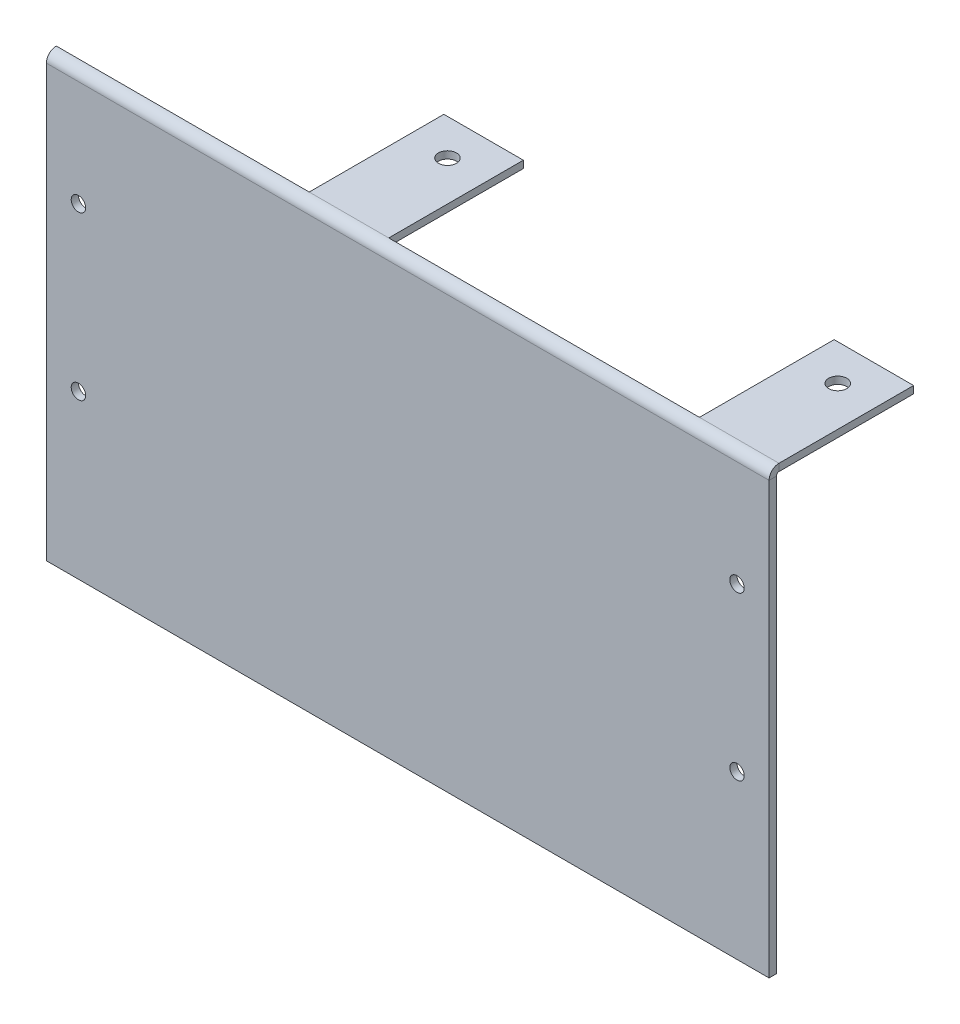
ISO-10303-21;
HEADER;
FILE_DESCRIPTION(('STEP AP214'),'2;1');
FILE_NAME('part.step','',(''),(''),'','','');
FILE_SCHEMA(('AUTOMOTIVE_DESIGN { 1 0 10303 214 1 1 1 1 }'));
ENDSEC;
DATA;
#1=APPLICATION_CONTEXT('core data for automotive mechanical design processes');
#2=APPLICATION_PROTOCOL_DEFINITION('international standard','automotive_design',2000,#1);
#3=PRODUCT_CONTEXT('',#1,'mechanical');
#4=PRODUCT('Part','Part','',(#3));
#5=PRODUCT_RELATED_PRODUCT_CATEGORY('part','',(#4));
#6=PRODUCT_DEFINITION_FORMATION('','',#4);
#7=PRODUCT_DEFINITION_CONTEXT('part definition',#1,'design');
#8=PRODUCT_DEFINITION('design','',#6,#7);
#9=PRODUCT_DEFINITION_SHAPE('','',#8);
#10=(LENGTH_UNIT() NAMED_UNIT(*) SI_UNIT(.MILLI.,.METRE.));
#11=(NAMED_UNIT(*) PLANE_ANGLE_UNIT() SI_UNIT($,.RADIAN.));
#12=(NAMED_UNIT(*) SI_UNIT($,.STERADIAN.) SOLID_ANGLE_UNIT());
#13=UNCERTAINTY_MEASURE_WITH_UNIT(LENGTH_MEASURE(1.E-05),#10,'distance_accuracy_value','');
#14=(GEOMETRIC_REPRESENTATION_CONTEXT(3) GLOBAL_UNCERTAINTY_ASSIGNED_CONTEXT((#13)) GLOBAL_UNIT_ASSIGNED_CONTEXT((#10,
#11,#12)) REPRESENTATION_CONTEXT('',''));
#15=CARTESIAN_POINT('',(0.,0.,0.));
#16=DIRECTION('',(0.,0.,1.));
#17=DIRECTION('',(1.,0.,0.));
#18=AXIS2_PLACEMENT_3D('',#15,#16,#17);
#19=CARTESIAN_POINT('',(0.,122.,4.45228893450774E-13));
#20=DIRECTION('',(0.,1.,0.));
#21=DIRECTION('',(0.,0.,1.));
#22=AXIS2_PLACEMENT_3D('',#19,#20,#21);
#23=PLANE('',#22);
#24=DIRECTION('',(0.,0.,-1.));
#25=VECTOR('',#24,1.);
#26=CARTESIAN_POINT('',(178.,122.,-2.73659999999998));
#27=LINE('',#26,#25);
#28=CARTESIAN_POINT('',(178.,122.,-2.73659999999998));
#29=VERTEX_POINT('',#28);
#30=CARTESIAN_POINT('',(178.,122.,-40.));
#31=VERTEX_POINT('',#30);
#32=EDGE_CURVE('E290',#29,#31,#27,.T.);
#33=ORIENTED_EDGE('',*,*,#32,.F.);
#34=DIRECTION('',(1.,0.,0.));
#35=VECTOR('',#34,1.);
#36=CARTESIAN_POINT('',(0.,122.,-2.7366));
#37=LINE('',#36,#35);
#38=CARTESIAN_POINT('',(200.,122.,-2.7366));
#39=VERTEX_POINT('',#38);
#40=EDGE_CURVE('E246',#29,#39,#37,.T.);
#41=ORIENTED_EDGE('',*,*,#40,.T.);
#42=DIRECTION('',(0.,0.,1.));
#43=VECTOR('',#42,1.);
#44=CARTESIAN_POINT('',(200.,122.,-1.99999999999999));
#45=LINE('',#44,#43);
#46=CARTESIAN_POINT('',(200.,122.,-40.));
#47=VERTEX_POINT('',#46);
#48=EDGE_CURVE('E156',#47,#39,#45,.T.);
#49=ORIENTED_EDGE('',*,*,#48,.F.);
#50=DIRECTION('',(1.,0.,0.));
#51=VECTOR('',#50,1.);
#52=CARTESIAN_POINT('',(200.,122.,-40.));
#53=LINE('',#52,#51);
#54=EDGE_CURVE('E152',#31,#47,#53,.T.);
#55=ORIENTED_EDGE('',*,*,#54,.F.);
#56=EDGE_LOOP('',(#33,#41,#49,#55));
#57=FACE_BOUND('',#56,.T.);
#58=CARTESIAN_POINT('',(189.,122.,-30.));
#59=DIRECTION('',(0.,1.,0.));
#60=DIRECTION('',(0.,0.,1.));
#61=AXIS2_PLACEMENT_3D('',#58,#59,#60);
#62=CIRCLE('',#61,2.5);
#63=CARTESIAN_POINT('',(189.,122.,-27.5));
#64=VERTEX_POINT('',#63);
#65=EDGE_CURVE('E266',#64,#64,#62,.T.);
#66=ORIENTED_EDGE('',*,*,#65,.F.);
#67=EDGE_LOOP('',(#66));
#68=FACE_BOUND('',#67,.T.);
#69=ADVANCED_FACE('F38',(#57,#68),#23,.T.);
#70=CARTESIAN_POINT('',(0.,120.,4.38245930773088E-13));
#71=DIRECTION('',(0.,1.,0.));
#72=DIRECTION('',(0.,0.,1.));
#73=AXIS2_PLACEMENT_3D('',#70,#71,#72);
#74=PLANE('',#73);
#75=CARTESIAN_POINT('',(189.,120.,-30.));
#76=DIRECTION('',(0.,1.,0.));
#77=DIRECTION('',(0.,0.,1.));
#78=AXIS2_PLACEMENT_3D('',#75,#76,#77);
#79=CIRCLE('',#78,2.5);
#80=CARTESIAN_POINT('',(189.,120.,-27.5));
#81=VERTEX_POINT('',#80);
#82=EDGE_CURVE('E261',#81,#81,#79,.F.);
#83=ORIENTED_EDGE('',*,*,#82,.F.);
#84=EDGE_LOOP('',(#83));
#85=FACE_BOUND('',#84,.T.);
#86=DIRECTION('',(1.,0.,0.));
#87=VECTOR('',#86,1.);
#88=CARTESIAN_POINT('',(0.,120.,-2.73660000000001));
#89=LINE('',#88,#87);
#90=CARTESIAN_POINT('',(178.,120.,-2.73659999999999));
#91=VERTEX_POINT('',#90);
#92=CARTESIAN_POINT('',(200.,120.,-2.73660000000001));
#93=VERTEX_POINT('',#92);
#94=EDGE_CURVE('E260',#91,#93,#89,.T.);
#95=ORIENTED_EDGE('',*,*,#94,.F.);
#96=DIRECTION('',(0.,0.,1.));
#97=VECTOR('',#96,1.);
#98=CARTESIAN_POINT('',(178.,120.,-2.73659999999999));
#99=LINE('',#98,#97);
#100=CARTESIAN_POINT('',(178.,120.,-40.));
#101=VERTEX_POINT('',#100);
#102=EDGE_CURVE('E292',#101,#91,#99,.T.);
#103=ORIENTED_EDGE('',*,*,#102,.F.);
#104=DIRECTION('',(1.,0.,0.));
#105=VECTOR('',#104,1.);
#106=CARTESIAN_POINT('',(200.,120.,-40.));
#107=LINE('',#106,#105);
#108=CARTESIAN_POINT('',(200.,120.,-40.));
#109=VERTEX_POINT('',#108);
#110=EDGE_CURVE('E149',#101,#109,#107,.T.);
#111=ORIENTED_EDGE('',*,*,#110,.T.);
#112=DIRECTION('',(0.,0.,1.));
#113=VECTOR('',#112,1.);
#114=CARTESIAN_POINT('',(200.,120.,-2.));
#115=LINE('',#114,#113);
#116=EDGE_CURVE('E148',#109,#93,#115,.T.);
#117=ORIENTED_EDGE('',*,*,#116,.T.);
#118=EDGE_LOOP('',(#95,#103,#111,#117));
#119=FACE_BOUND('',#118,.T.);
#120=ADVANCED_FACE('F320',(#85,#119),#74,.F.);
#121=CARTESIAN_POINT('',(200.,122.,-40.));
#122=DIRECTION('',(0.,0.,-1.));
#123=DIRECTION('',(0.,1.,0.));
#124=AXIS2_PLACEMENT_3D('',#121,#122,#123);
#125=PLANE('',#124);
#126=DIRECTION('',(0.,1.,0.));
#127=VECTOR('',#126,1.);
#128=CARTESIAN_POINT('',(178.,-0.000999999999987122,-40.0000000000004));
#129=LINE('',#128,#127);
#130=EDGE_CURVE('E276',#101,#31,#129,.T.);
#131=ORIENTED_EDGE('',*,*,#130,.T.);
#132=ORIENTED_EDGE('',*,*,#54,.T.);
#133=DIRECTION('',(0.,-1.,0.));
#134=VECTOR('',#133,1.);
#135=CARTESIAN_POINT('',(200.,122.,-40.));
#136=LINE('',#135,#134);
#137=EDGE_CURVE('E159',#47,#109,#136,.T.);
#138=ORIENTED_EDGE('',*,*,#137,.T.);
#139=ORIENTED_EDGE('',*,*,#110,.F.);
#140=EDGE_LOOP('',(#131,#132,#138,#139));
#141=FACE_BOUND('',#140,.T.);
#142=ADVANCED_FACE('F317',(#141),#125,.T.);
#143=CARTESIAN_POINT('',(200.,0.,-2.));
#144=DIRECTION('',(1.,0.,0.));
#145=DIRECTION('',(0.,0.,-1.));
#146=AXIS2_PLACEMENT_3D('',#143,#144,#145);
#147=PLANE('',#146);
#148=DIRECTION('',(0.,1.,0.));
#149=VECTOR('',#148,1.);
#150=CARTESIAN_POINT('',(200.,0.,-2.));
#151=LINE('',#150,#149);
#152=CARTESIAN_POINT('',(200.,0.,-2.));
#153=VERTEX_POINT('',#152);
#154=CARTESIAN_POINT('',(200.,119.2634,-2.));
#155=VERTEX_POINT('',#154);
#156=EDGE_CURVE('E215',#153,#155,#151,.T.);
#157=ORIENTED_EDGE('',*,*,#156,.T.);
#158=DIRECTION('',(0.,0.,1.));
#159=VECTOR('',#158,1.);
#160=CARTESIAN_POINT('',(200.,119.2634,-2.));
#161=LINE('',#160,#159);
#162=CARTESIAN_POINT('',(200.,119.2634,0.));
#163=VERTEX_POINT('',#162);
#164=EDGE_CURVE('E169',#155,#163,#161,.T.);
#165=ORIENTED_EDGE('',*,*,#164,.T.);
#166=DIRECTION('',(0.,1.,0.));
#167=VECTOR('',#166,1.);
#168=CARTESIAN_POINT('',(200.,0.,0.));
#169=LINE('',#168,#167);
#170=CARTESIAN_POINT('',(200.,0.,0.));
#171=VERTEX_POINT('',#170);
#172=EDGE_CURVE('E212',#171,#163,#169,.T.);
#173=ORIENTED_EDGE('',*,*,#172,.F.);
#174=DIRECTION('',(0.,0.,1.));
#175=VECTOR('',#174,1.);
#176=CARTESIAN_POINT('',(200.,0.,-2.));
#177=LINE('',#176,#175);
#178=EDGE_CURVE('E11',#153,#171,#177,.T.);
#179=ORIENTED_EDGE('',*,*,#178,.F.);
#180=EDGE_LOOP('',(#157,#165,#173,#179));
#181=FACE_BOUND('',#180,.T.);
#182=ADVANCED_FACE('F389',(#181),#147,.T.);
#183=CARTESIAN_POINT('',(0.,0.,-2.));
#184=DIRECTION('',(0.,0.,-1.));
#185=DIRECTION('',(-1.,0.,0.));
#186=AXIS2_PLACEMENT_3D('',#183,#184,#185);
#187=PLANE('',#186);
#188=CARTESIAN_POINT('',(8.86999999999999,90.,-2.));
#189=DIRECTION('',(0.,0.,-1.));
#190=DIRECTION('',(-1.,0.,0.));
#191=AXIS2_PLACEMENT_3D('',#188,#189,#190);
#192=CIRCLE('',#191,2.);
#193=CARTESIAN_POINT('',(6.86999999999999,90.,-2.));
#194=VERTEX_POINT('',#193);
#195=EDGE_CURVE('E200',#194,#194,#192,.F.);
#196=ORIENTED_EDGE('',*,*,#195,.T.);
#197=EDGE_LOOP('',(#196));
#198=FACE_BOUND('',#197,.T.);
#199=CARTESIAN_POINT('',(8.86999999999999,45.,-2.));
#200=DIRECTION('',(0.,0.,-1.));
#201=DIRECTION('',(-1.,0.,0.));
#202=AXIS2_PLACEMENT_3D('',#199,#200,#201);
#203=CIRCLE('',#202,2.);
#204=CARTESIAN_POINT('',(6.86999999999999,45.,-2.));
#205=VERTEX_POINT('',#204);
#206=EDGE_CURVE('E194',#205,#205,#203,.F.);
#207=ORIENTED_EDGE('',*,*,#206,.T.);
#208=EDGE_LOOP('',(#207));
#209=FACE_BOUND('',#208,.T.);
#210=CARTESIAN_POINT('',(191.13,45.,-2.));
#211=DIRECTION('',(0.,0.,-1.));
#212=DIRECTION('',(-1.,0.,0.));
#213=AXIS2_PLACEMENT_3D('',#210,#211,#212);
#214=CIRCLE('',#213,2.);
#215=CARTESIAN_POINT('',(189.13,45.,-2.));
#216=VERTEX_POINT('',#215);
#217=EDGE_CURVE('E188',#216,#216,#214,.F.);
#218=ORIENTED_EDGE('',*,*,#217,.T.);
#219=EDGE_LOOP('',(#218));
#220=FACE_BOUND('',#219,.T.);
#221=CARTESIAN_POINT('',(191.13,90.,-2.));
#222=DIRECTION('',(0.,0.,-1.));
#223=DIRECTION('',(-1.,0.,0.));
#224=AXIS2_PLACEMENT_3D('',#221,#222,#223);
#225=CIRCLE('',#224,2.);
#226=CARTESIAN_POINT('',(189.13,90.,-2.));
#227=VERTEX_POINT('',#226);
#228=EDGE_CURVE('E183',#227,#227,#225,.F.);
#229=ORIENTED_EDGE('',*,*,#228,.T.);
#230=EDGE_LOOP('',(#229));
#231=FACE_BOUND('',#230,.T.);
#232=DIRECTION('',(0.,-1.,0.));
#233=VECTOR('',#232,1.);
#234=CARTESIAN_POINT('',(0.,0.,-2.));
#235=LINE('',#234,#233);
#236=CARTESIAN_POINT('',(0.,119.2634,-2.));
#237=VERTEX_POINT('',#236);
#238=CARTESIAN_POINT('',(0.,0.,-2.));
#239=VERTEX_POINT('',#238);
#240=EDGE_CURVE('E209',#237,#239,#235,.T.);
#241=ORIENTED_EDGE('',*,*,#240,.F.);
#242=DIRECTION('',(1.,0.,0.));
#243=VECTOR('',#242,1.);
#244=CARTESIAN_POINT('',(200.,119.2634,-2.));
#245=LINE('',#244,#243);
#246=EDGE_CURVE('E175',#155,#237,#245,.F.);
#247=ORIENTED_EDGE('',*,*,#246,.F.);
#248=ORIENTED_EDGE('',*,*,#156,.F.);
#249=DIRECTION('',(1.,0.,0.));
#250=VECTOR('',#249,1.);
#251=CARTESIAN_POINT('',(0.,0.,-2.));
#252=LINE('',#251,#250);
#253=EDGE_CURVE('E211',#239,#153,#252,.T.);
#254=ORIENTED_EDGE('',*,*,#253,.F.);
#255=EDGE_LOOP('',(#241,#247,#248,#254));
#256=FACE_BOUND('',#255,.T.);
#257=ADVANCED_FACE('F386',(#198,#209,#220,#231,#256),#187,.T.);
#258=CARTESIAN_POINT('',(0.,0.,0.));
#259=DIRECTION('',(0.,0.,-1.));
#260=DIRECTION('',(-1.,0.,0.));
#261=AXIS2_PLACEMENT_3D('',#258,#259,#260);
#262=PLANE('',#261);
#263=CARTESIAN_POINT('',(8.86999999999999,90.,0.));
#264=DIRECTION('',(0.,0.,1.));
#265=DIRECTION('',(1.,0.,0.));
#266=AXIS2_PLACEMENT_3D('',#263,#264,#265);
#267=CIRCLE('',#266,2.);
#268=CARTESIAN_POINT('',(10.87,90.,0.));
#269=VERTEX_POINT('',#268);
#270=EDGE_CURVE('E203',#269,#269,#267,.T.);
#271=ORIENTED_EDGE('',*,*,#270,.F.);
#272=EDGE_LOOP('',(#271));
#273=FACE_BOUND('',#272,.T.);
#274=CARTESIAN_POINT('',(8.86999999999999,45.,0.));
#275=DIRECTION('',(0.,0.,1.));
#276=DIRECTION('',(1.,0.,0.));
#277=AXIS2_PLACEMENT_3D('',#274,#275,#276);
#278=CIRCLE('',#277,2.);
#279=CARTESIAN_POINT('',(10.87,45.,0.));
#280=VERTEX_POINT('',#279);
#281=EDGE_CURVE('E197',#280,#280,#278,.T.);
#282=ORIENTED_EDGE('',*,*,#281,.F.);
#283=EDGE_LOOP('',(#282));
#284=FACE_BOUND('',#283,.T.);
#285=CARTESIAN_POINT('',(191.13,45.,0.));
#286=DIRECTION('',(0.,0.,1.));
#287=DIRECTION('',(1.,0.,0.));
#288=AXIS2_PLACEMENT_3D('',#285,#286,#287);
#289=CIRCLE('',#288,2.);
#290=CARTESIAN_POINT('',(193.13,45.,0.));
#291=VERTEX_POINT('',#290);
#292=EDGE_CURVE('E191',#291,#291,#289,.T.);
#293=ORIENTED_EDGE('',*,*,#292,.F.);
#294=EDGE_LOOP('',(#293));
#295=FACE_BOUND('',#294,.T.);
#296=CARTESIAN_POINT('',(191.13,90.,0.));
#297=DIRECTION('',(0.,0.,1.));
#298=DIRECTION('',(1.,0.,0.));
#299=AXIS2_PLACEMENT_3D('',#296,#297,#298);
#300=CIRCLE('',#299,2.);
#301=CARTESIAN_POINT('',(193.13,90.,0.));
#302=VERTEX_POINT('',#301);
#303=EDGE_CURVE('E185',#302,#302,#300,.T.);
#304=ORIENTED_EDGE('',*,*,#303,.F.);
#305=EDGE_LOOP('',(#304));
#306=FACE_BOUND('',#305,.T.);
#307=DIRECTION('',(1.,0.,0.));
#308=VECTOR('',#307,1.);
#309=CARTESIAN_POINT('',(200.,119.2634,0.));
#310=LINE('',#309,#308);
#311=CARTESIAN_POINT('',(0.,119.2634,0.));
#312=VERTEX_POINT('',#311);
#313=EDGE_CURVE('E163',#163,#312,#310,.F.);
#314=ORIENTED_EDGE('',*,*,#313,.T.);
#315=DIRECTION('',(0.,-1.,0.));
#316=VECTOR('',#315,1.);
#317=CARTESIAN_POINT('',(0.,0.,0.));
#318=LINE('',#317,#316);
#319=CARTESIAN_POINT('',(0.,0.,0.));
#320=VERTEX_POINT('',#319);
#321=EDGE_CURVE('E206',#312,#320,#318,.T.);
#322=ORIENTED_EDGE('',*,*,#321,.T.);
#323=DIRECTION('',(1.,0.,0.));
#324=VECTOR('',#323,1.);
#325=CARTESIAN_POINT('',(0.,0.,0.));
#326=LINE('',#325,#324);
#327=EDGE_CURVE('E219',#320,#171,#326,.T.);
#328=ORIENTED_EDGE('',*,*,#327,.T.);
#329=ORIENTED_EDGE('',*,*,#172,.T.);
#330=EDGE_LOOP('',(#314,#322,#328,#329));
#331=FACE_BOUND('',#330,.T.);
#332=ADVANCED_FACE('F226',(#273,#284,#295,#306,#331),#262,.F.);
#333=CARTESIAN_POINT('',(0.,0.,-2.));
#334=DIRECTION('',(-1.,0.,0.));
#335=DIRECTION('',(0.,0.,1.));
#336=AXIS2_PLACEMENT_3D('',#333,#334,#335);
#337=PLANE('',#336);
#338=DIRECTION('',(0.,0.,1.));
#339=VECTOR('',#338,1.);
#340=CARTESIAN_POINT('',(0.,119.2634,-2.));
#341=LINE('',#340,#339);
#342=EDGE_CURVE('E180',#237,#312,#341,.T.);
#343=ORIENTED_EDGE('',*,*,#342,.F.);
#344=ORIENTED_EDGE('',*,*,#240,.T.);
#345=DIRECTION('',(0.,0.,1.));
#346=VECTOR('',#345,1.);
#347=CARTESIAN_POINT('',(0.,0.,-2.));
#348=LINE('',#347,#346);
#349=EDGE_CURVE('E42',#239,#320,#348,.T.);
#350=ORIENTED_EDGE('',*,*,#349,.T.);
#351=ORIENTED_EDGE('',*,*,#321,.F.);
#352=EDGE_LOOP('',(#343,#344,#350,#351));
#353=FACE_BOUND('',#352,.T.);
#354=ADVANCED_FACE('F40',(#353),#337,.T.);
#355=CARTESIAN_POINT('',(0.,0.,-2.));
#356=DIRECTION('',(0.,-1.,0.));
#357=DIRECTION('',(0.,0.,-1.));
#358=AXIS2_PLACEMENT_3D('',#355,#356,#357);
#359=PLANE('',#358);
#360=ORIENTED_EDGE('',*,*,#327,.F.);
#361=ORIENTED_EDGE('',*,*,#349,.F.);
#362=ORIENTED_EDGE('',*,*,#253,.T.);
#363=ORIENTED_EDGE('',*,*,#178,.T.);
#364=EDGE_LOOP('',(#360,#361,#362,#363));
#365=FACE_BOUND('',#364,.T.);
#366=ADVANCED_FACE('F384',(#365),#359,.T.);
#367=CARTESIAN_POINT('',(8.86999999999999,90.,-2.001));
#368=DIRECTION('',(0.,0.,1.));
#369=DIRECTION('',(1.,0.,0.));
#370=AXIS2_PLACEMENT_3D('',#367,#368,#369);
#371=CYLINDRICAL_SURFACE('',#370,2.);
#372=ORIENTED_EDGE('',*,*,#195,.F.);
#373=EDGE_LOOP('',(#372));
#374=FACE_BOUND('',#373,.T.);
#375=ORIENTED_EDGE('',*,*,#270,.T.);
#376=EDGE_LOOP('',(#375));
#377=FACE_BOUND('',#376,.T.);
#378=ADVANCED_FACE('F380',(#374,#377),#371,.F.);
#379=CARTESIAN_POINT('',(8.86999999999999,45.,-2.001));
#380=DIRECTION('',(0.,0.,1.));
#381=DIRECTION('',(1.,0.,0.));
#382=AXIS2_PLACEMENT_3D('',#379,#380,#381);
#383=CYLINDRICAL_SURFACE('',#382,2.);
#384=ORIENTED_EDGE('',*,*,#206,.F.);
#385=EDGE_LOOP('',(#384));
#386=FACE_BOUND('',#385,.T.);
#387=ORIENTED_EDGE('',*,*,#281,.T.);
#388=EDGE_LOOP('',(#387));
#389=FACE_BOUND('',#388,.T.);
#390=ADVANCED_FACE('F376',(#386,#389),#383,.F.);
#391=CARTESIAN_POINT('',(191.13,45.,-2.001));
#392=DIRECTION('',(0.,0.,1.));
#393=DIRECTION('',(1.,0.,0.));
#394=AXIS2_PLACEMENT_3D('',#391,#392,#393);
#395=CYLINDRICAL_SURFACE('',#394,2.);
#396=ORIENTED_EDGE('',*,*,#217,.F.);
#397=EDGE_LOOP('',(#396));
#398=FACE_BOUND('',#397,.T.);
#399=ORIENTED_EDGE('',*,*,#292,.T.);
#400=EDGE_LOOP('',(#399));
#401=FACE_BOUND('',#400,.T.);
#402=ADVANCED_FACE('F372',(#398,#401),#395,.F.);
#403=CARTESIAN_POINT('',(191.13,90.,-2.001));
#404=DIRECTION('',(0.,0.,1.));
#405=DIRECTION('',(1.,0.,0.));
#406=AXIS2_PLACEMENT_3D('',#403,#404,#405);
#407=CYLINDRICAL_SURFACE('',#406,2.);
#408=ORIENTED_EDGE('',*,*,#228,.F.);
#409=EDGE_LOOP('',(#408));
#410=FACE_BOUND('',#409,.T.);
#411=ORIENTED_EDGE('',*,*,#303,.T.);
#412=EDGE_LOOP('',(#411));
#413=FACE_BOUND('',#412,.T.);
#414=ADVANCED_FACE('F366',(#410,#413),#407,.F.);
#415=CARTESIAN_POINT('',(0.,119.2634,-2.73660000000001));
#416=DIRECTION('',(-1.,0.,0.));
#417=DIRECTION('',(0.,0.,1.));
#418=AXIS2_PLACEMENT_3D('',#415,#416,#417);
#419=PLANE('',#418);
#420=DIRECTION('',(0.,1.,0.));
#421=VECTOR('',#420,1.);
#422=CARTESIAN_POINT('',(0.,120.,-2.73660000000001));
#423=LINE('',#422,#421);
#424=CARTESIAN_POINT('',(0.,120.,-2.73660000000001));
#425=VERTEX_POINT('',#424);
#426=CARTESIAN_POINT('',(0.,122.,-2.7366));
#427=VERTEX_POINT('',#426);
#428=EDGE_CURVE('E259',#425,#427,#423,.T.);
#429=ORIENTED_EDGE('',*,*,#428,.F.);
#430=CARTESIAN_POINT('',(0.,119.2634,-2.73660000000001));
#431=DIRECTION('',(1.,0.,0.));
#432=DIRECTION('',(0.,0.,-1.));
#433=AXIS2_PLACEMENT_3D('',#430,#431,#432);
#434=CIRCLE('',#433,0.736600000000004);
#435=EDGE_CURVE('E172',#237,#425,#434,.F.);
#436=ORIENTED_EDGE('',*,*,#435,.F.);
#437=ORIENTED_EDGE('',*,*,#342,.T.);
#438=CARTESIAN_POINT('',(0.,119.2634,-2.73660000000001));
#439=DIRECTION('',(1.,0.,0.));
#440=DIRECTION('',(0.,0.,-1.));
#441=AXIS2_PLACEMENT_3D('',#438,#439,#440);
#442=CIRCLE('',#441,2.7366);
#443=EDGE_CURVE('E165',#312,#427,#442,.F.);
#444=ORIENTED_EDGE('',*,*,#443,.T.);
#445=EDGE_LOOP('',(#429,#436,#437,#444));
#446=FACE_BOUND('',#445,.T.);
#447=ADVANCED_FACE('F363',(#446),#419,.T.);
#448=CARTESIAN_POINT('',(200.,119.2634,-2.73660000000001));
#449=DIRECTION('',(-1.,0.,0.));
#450=DIRECTION('',(0.,0.,1.));
#451=AXIS2_PLACEMENT_3D('',#448,#449,#450);
#452=PLANE('',#451);
#453=CARTESIAN_POINT('',(200.,119.2634,-2.73660000000001));
#454=DIRECTION('',(1.,0.,0.));
#455=DIRECTION('',(0.,0.,-1.));
#456=AXIS2_PLACEMENT_3D('',#453,#454,#455);
#457=CIRCLE('',#456,0.736600000000004);
#458=EDGE_CURVE('E162',#93,#155,#457,.T.);
#459=ORIENTED_EDGE('',*,*,#458,.F.);
#460=DIRECTION('',(0.,1.,0.));
#461=VECTOR('',#460,1.);
#462=CARTESIAN_POINT('',(200.,120.,-2.73660000000001));
#463=LINE('',#462,#461);
#464=EDGE_CURVE('E242',#93,#39,#463,.T.);
#465=ORIENTED_EDGE('',*,*,#464,.T.);
#466=CARTESIAN_POINT('',(200.,119.2634,-2.73660000000001));
#467=DIRECTION('',(1.,0.,0.));
#468=DIRECTION('',(0.,0.,-1.));
#469=AXIS2_PLACEMENT_3D('',#466,#467,#468);
#470=CIRCLE('',#469,2.7366);
#471=EDGE_CURVE('E166',#39,#163,#470,.T.);
#472=ORIENTED_EDGE('',*,*,#471,.T.);
#473=ORIENTED_EDGE('',*,*,#164,.F.);
#474=EDGE_LOOP('',(#459,#465,#472,#473));
#475=FACE_BOUND('',#474,.T.);
#476=ADVANCED_FACE('F240',(#475),#452,.F.);
#477=CARTESIAN_POINT('',(200.,119.2634,-2.73660000000001));
#478=DIRECTION('',(1.,0.,0.));
#479=DIRECTION('',(0.,1.,0.));
#480=AXIS2_PLACEMENT_3D('',#477,#478,#479);
#481=CYLINDRICAL_SURFACE('',#480,2.7366);
#482=ORIENTED_EDGE('',*,*,#313,.F.);
#483=ORIENTED_EDGE('',*,*,#471,.F.);
#484=ORIENTED_EDGE('',*,*,#40,.F.);
#485=DIRECTION('',(1.,0.,0.));
#486=VECTOR('',#485,1.);
#487=CARTESIAN_POINT('',(178.,122.,-2.73659999999998));
#488=LINE('',#487,#486);
#489=CARTESIAN_POINT('',(92.,122.,-2.73659999999992));
#490=VERTEX_POINT('',#489);
#491=EDGE_CURVE('E279',#490,#29,#488,.T.);
#492=ORIENTED_EDGE('',*,*,#491,.F.);
#493=CARTESIAN_POINT('',(70.,122.,-2.73659999999992));
#494=VERTEX_POINT('',#493);
#495=EDGE_CURVE('E258',#494,#490,#37,.T.);
#496=ORIENTED_EDGE('',*,*,#495,.F.);
#497=EDGE_CURVE('E154',#427,#494,#37,.T.);
#498=ORIENTED_EDGE('',*,*,#497,.F.);
#499=ORIENTED_EDGE('',*,*,#443,.F.);
#500=EDGE_LOOP('',(#482,#483,#484,#492,#496,#498,#499));
#501=FACE_BOUND('',#500,.T.);
#502=ADVANCED_FACE('F233',(#501),#481,.T.);
#503=CARTESIAN_POINT('',(200.,119.2634,-2.73660000000001));
#504=DIRECTION('',(1.,0.,0.));
#505=DIRECTION('',(0.,1.,0.));
#506=AXIS2_PLACEMENT_3D('',#503,#504,#505);
#507=CYLINDRICAL_SURFACE('',#506,0.736600000000004);
#508=ORIENTED_EDGE('',*,*,#246,.T.);
#509=ORIENTED_EDGE('',*,*,#435,.T.);
#510=CARTESIAN_POINT('',(70.,120.,-2.73659999999993));
#511=VERTEX_POINT('',#510);
#512=EDGE_CURVE('E247',#425,#511,#89,.T.);
#513=ORIENTED_EDGE('',*,*,#512,.T.);
#514=CARTESIAN_POINT('',(92.,120.,-2.73659999999993));
#515=VERTEX_POINT('',#514);
#516=EDGE_CURVE('E141',#511,#515,#89,.T.);
#517=ORIENTED_EDGE('',*,*,#516,.T.);
#518=DIRECTION('',(1.,0.,0.));
#519=VECTOR('',#518,1.);
#520=CARTESIAN_POINT('',(0.,120.,-2.73660000000001));
#521=LINE('',#520,#519);
#522=EDGE_CURVE('E297',#515,#91,#521,.T.);
#523=ORIENTED_EDGE('',*,*,#522,.T.);
#524=ORIENTED_EDGE('',*,*,#94,.T.);
#525=ORIENTED_EDGE('',*,*,#458,.T.);
#526=EDGE_LOOP('',(#508,#509,#513,#517,#523,#524,#525));
#527=FACE_BOUND('',#526,.T.);
#528=ADVANCED_FACE('F323',(#527),#507,.F.);
#529=CARTESIAN_POINT('',(200.,122.,-1.99999999999999));
#530=DIRECTION('',(1.,0.,0.));
#531=DIRECTION('',(0.,0.,-1.));
#532=AXIS2_PLACEMENT_3D('',#529,#530,#531);
#533=PLANE('',#532);
#534=ORIENTED_EDGE('',*,*,#48,.T.);
#535=ORIENTED_EDGE('',*,*,#464,.F.);
#536=ORIENTED_EDGE('',*,*,#116,.F.);
#537=ORIENTED_EDGE('',*,*,#137,.F.);
#538=EDGE_LOOP('',(#534,#535,#536,#537));
#539=FACE_BOUND('',#538,.T.);
#540=ADVANCED_FACE('F251',(#539),#533,.T.);
#541=DIRECTION('',(0.,0.,-1.));
#542=VECTOR('',#541,1.);
#543=CARTESIAN_POINT('',(70.,122.,-2.73659999999992));
#544=LINE('',#543,#542);
#545=CARTESIAN_POINT('',(70.,122.,-40.));
#546=VERTEX_POINT('',#545);
#547=EDGE_CURVE('E53',#494,#546,#544,.T.);
#548=ORIENTED_EDGE('',*,*,#547,.F.);
#549=ORIENTED_EDGE('',*,*,#495,.T.);
#550=DIRECTION('',(0.,0.,1.));
#551=VECTOR('',#550,1.);
#552=CARTESIAN_POINT('',(92.,122.,-2.73659999999992));
#553=LINE('',#552,#551);
#554=CARTESIAN_POINT('',(92.,122.,-40.));
#555=VERTEX_POINT('',#554);
#556=EDGE_CURVE('E287',#555,#490,#553,.T.);
#557=ORIENTED_EDGE('',*,*,#556,.F.);
#558=EDGE_CURVE('E254',#546,#555,#53,.T.);
#559=ORIENTED_EDGE('',*,*,#558,.F.);
#560=EDGE_LOOP('',(#548,#549,#557,#559));
#561=FACE_BOUND('',#560,.T.);
#562=CARTESIAN_POINT('',(81.,122.,-30.));
#563=DIRECTION('',(0.,1.,0.));
#564=DIRECTION('',(0.,0.,1.));
#565=AXIS2_PLACEMENT_3D('',#562,#563,#564);
#566=CIRCLE('',#565,2.50000000000001);
#567=CARTESIAN_POINT('',(81.,122.,-27.5));
#568=VERTEX_POINT('',#567);
#569=EDGE_CURVE('E272',#568,#568,#566,.T.);
#570=ORIENTED_EDGE('',*,*,#569,.F.);
#571=EDGE_LOOP('',(#570));
#572=FACE_BOUND('',#571,.T.);
#573=ADVANCED_FACE('F306',(#561,#572),#23,.T.);
#574=CARTESIAN_POINT('',(81.,120.,-30.));
#575=DIRECTION('',(0.,1.,0.));
#576=DIRECTION('',(0.,0.,1.));
#577=AXIS2_PLACEMENT_3D('',#574,#575,#576);
#578=CIRCLE('',#577,2.50000000000001);
#579=CARTESIAN_POINT('',(81.,120.,-27.5));
#580=VERTEX_POINT('',#579);
#581=EDGE_CURVE('E269',#580,#580,#578,.F.);
#582=ORIENTED_EDGE('',*,*,#581,.F.);
#583=EDGE_LOOP('',(#582));
#584=FACE_BOUND('',#583,.T.);
#585=ORIENTED_EDGE('',*,*,#516,.F.);
#586=DIRECTION('',(0.,0.,1.));
#587=VECTOR('',#586,1.);
#588=CARTESIAN_POINT('',(70.,120.,-2.73659999999993));
#589=LINE('',#588,#587);
#590=CARTESIAN_POINT('',(70.,120.,-40.));
#591=VERTEX_POINT('',#590);
#592=EDGE_CURVE('E134',#591,#511,#589,.T.);
#593=ORIENTED_EDGE('',*,*,#592,.F.);
#594=CARTESIAN_POINT('',(92.,120.,-40.));
#595=VERTEX_POINT('',#594);
#596=EDGE_CURVE('E61',#591,#595,#107,.T.);
#597=ORIENTED_EDGE('',*,*,#596,.T.);
#598=DIRECTION('',(0.,0.,-1.));
#599=VECTOR('',#598,1.);
#600=CARTESIAN_POINT('',(92.,120.,-2.73659999999993));
#601=LINE('',#600,#599);
#602=EDGE_CURVE('E295',#515,#595,#601,.T.);
#603=ORIENTED_EDGE('',*,*,#602,.F.);
#604=EDGE_LOOP('',(#585,#593,#597,#603));
#605=FACE_BOUND('',#604,.T.);
#606=ADVANCED_FACE('F140',(#584,#605),#74,.F.);
#607=DIRECTION('',(0.,1.,0.));
#608=VECTOR('',#607,1.);
#609=CARTESIAN_POINT('',(70.,-0.000999999999987122,-40.0000000000004));
#610=LINE('',#609,#608);
#611=EDGE_CURVE('E132',#591,#546,#610,.T.);
#612=ORIENTED_EDGE('',*,*,#611,.T.);
#613=ORIENTED_EDGE('',*,*,#558,.T.);
#614=DIRECTION('',(0.,1.,0.));
#615=VECTOR('',#614,1.);
#616=CARTESIAN_POINT('',(92.,-0.000999999999987122,-40.0000000000005));
#617=LINE('',#616,#615);
#618=EDGE_CURVE('E147',#595,#555,#617,.T.);
#619=ORIENTED_EDGE('',*,*,#618,.F.);
#620=ORIENTED_EDGE('',*,*,#596,.F.);
#621=EDGE_LOOP('',(#612,#613,#619,#620));
#622=FACE_BOUND('',#621,.T.);
#623=ADVANCED_FACE('F145',(#622),#125,.T.);
#624=CARTESIAN_POINT('',(189.,-0.00100000000002876,-30.0000000000004));
#625=DIRECTION('',(0.,1.,0.));
#626=DIRECTION('',(0.,0.,1.));
#627=AXIS2_PLACEMENT_3D('',#624,#625,#626);
#628=CYLINDRICAL_SURFACE('',#627,2.5);
#629=ORIENTED_EDGE('',*,*,#65,.T.);
#630=EDGE_LOOP('',(#629));
#631=FACE_BOUND('',#630,.T.);
#632=ORIENTED_EDGE('',*,*,#82,.T.);
#633=EDGE_LOOP('',(#632));
#634=FACE_BOUND('',#633,.T.);
#635=ADVANCED_FACE('F360',(#631,#634),#628,.F.);
#636=CARTESIAN_POINT('',(81.,-0.00100000000002876,-30.0000000000004));
#637=DIRECTION('',(0.,1.,0.));
#638=DIRECTION('',(0.,0.,1.));
#639=AXIS2_PLACEMENT_3D('',#636,#637,#638);
#640=CYLINDRICAL_SURFACE('',#639,2.50000000000001);
#641=ORIENTED_EDGE('',*,*,#569,.T.);
#642=EDGE_LOOP('',(#641));
#643=FACE_BOUND('',#642,.T.);
#644=ORIENTED_EDGE('',*,*,#581,.T.);
#645=EDGE_LOOP('',(#644));
#646=FACE_BOUND('',#645,.T.);
#647=ADVANCED_FACE('F492',(#643,#646),#640,.F.);
#648=CARTESIAN_POINT('',(178.,-0.0010000000001259,-2.73660000000043));
#649=DIRECTION('',(1.,0.,0.));
#650=DIRECTION('',(0.,0.,-1.));
#651=AXIS2_PLACEMENT_3D('',#648,#649,#650);
#652=PLANE('',#651);
#653=ORIENTED_EDGE('',*,*,#102,.T.);
#654=DIRECTION('',(0.,1.,0.));
#655=VECTOR('',#654,1.);
#656=CARTESIAN_POINT('',(178.,-0.0010000000001259,-2.73660000000043));
#657=LINE('',#656,#655);
#658=EDGE_CURVE('E275',#91,#29,#657,.T.);
#659=ORIENTED_EDGE('',*,*,#658,.T.);
#660=ORIENTED_EDGE('',*,*,#32,.T.);
#661=ORIENTED_EDGE('',*,*,#130,.F.);
#662=EDGE_LOOP('',(#653,#659,#660,#661));
#663=FACE_BOUND('',#662,.T.);
#664=ADVANCED_FACE('F313',(#663),#652,.F.);
#665=CARTESIAN_POINT('',(178.,-0.0010000000001259,-2.73660000000043));
#666=DIRECTION('',(0.,0.,1.));
#667=DIRECTION('',(0.,-1.,0.));
#668=AXIS2_PLACEMENT_3D('',#665,#666,#667);
#669=PLANE('',#668);
#670=ORIENTED_EDGE('',*,*,#522,.F.);
#671=DIRECTION('',(0.,1.,0.));
#672=VECTOR('',#671,1.);
#673=CARTESIAN_POINT('',(92.,-0.0010000000001259,-2.73660000000037));
#674=LINE('',#673,#672);
#675=EDGE_CURVE('E281',#515,#490,#674,.T.);
#676=ORIENTED_EDGE('',*,*,#675,.T.);
#677=ORIENTED_EDGE('',*,*,#491,.T.);
#678=ORIENTED_EDGE('',*,*,#658,.F.);
#679=EDGE_LOOP('',(#670,#676,#677,#678));
#680=FACE_BOUND('',#679,.T.);
#681=ADVANCED_FACE('F326',(#680),#669,.F.);
#682=CARTESIAN_POINT('',(92.,-0.0010000000001259,-2.73660000000037));
#683=DIRECTION('',(-1.,0.,0.));
#684=DIRECTION('',(0.,0.,1.));
#685=AXIS2_PLACEMENT_3D('',#682,#683,#684);
#686=PLANE('',#685);
#687=ORIENTED_EDGE('',*,*,#602,.T.);
#688=ORIENTED_EDGE('',*,*,#618,.T.);
#689=ORIENTED_EDGE('',*,*,#556,.T.);
#690=ORIENTED_EDGE('',*,*,#675,.F.);
#691=EDGE_LOOP('',(#687,#688,#689,#690));
#692=FACE_BOUND('',#691,.T.);
#693=ADVANCED_FACE('F328',(#692),#686,.F.);
#694=CARTESIAN_POINT('',(70.,-0.0010000000001259,-2.73660000000037));
#695=DIRECTION('',(1.,0.,0.));
#696=DIRECTION('',(0.,0.,-1.));
#697=AXIS2_PLACEMENT_3D('',#694,#695,#696);
#698=PLANE('',#697);
#699=ORIENTED_EDGE('',*,*,#592,.T.);
#700=DIRECTION('',(0.,1.,0.));
#701=VECTOR('',#700,1.);
#702=CARTESIAN_POINT('',(70.,-0.0010000000001259,-2.73660000000037));
#703=LINE('',#702,#701);
#704=EDGE_CURVE('E138',#511,#494,#703,.T.);
#705=ORIENTED_EDGE('',*,*,#704,.T.);
#706=ORIENTED_EDGE('',*,*,#547,.T.);
#707=ORIENTED_EDGE('',*,*,#611,.F.);
#708=EDGE_LOOP('',(#699,#705,#706,#707));
#709=FACE_BOUND('',#708,.T.);
#710=ADVANCED_FACE('F133',(#709),#698,.F.);
#711=CARTESIAN_POINT('',(70.,-0.0010000000001259,-2.73660000000037));
#712=DIRECTION('',(0.,0.,1.));
#713=DIRECTION('',(0.,-1.,0.));
#714=AXIS2_PLACEMENT_3D('',#711,#712,#713);
#715=PLANE('',#714);
#716=ORIENTED_EDGE('',*,*,#512,.F.);
#717=ORIENTED_EDGE('',*,*,#428,.T.);
#718=ORIENTED_EDGE('',*,*,#497,.T.);
#719=ORIENTED_EDGE('',*,*,#704,.F.);
#720=EDGE_LOOP('',(#716,#717,#718,#719));
#721=FACE_BOUND('',#720,.T.);
#722=ADVANCED_FACE('F302',(#721),#715,.F.);
#723=CLOSED_SHELL('',(#69,#120,#142,#182,#257,#332,#354,#366,#378,#390,#402,#414,#447,#476,#502,
#528,#540,#573,#606,#623,#635,#647,#664,#681,#693,#710,#722));
#724=MANIFOLD_SOLID_BREP('B2',#723);
#725=ADVANCED_BREP_SHAPE_REPRESENTATION('',(#18,#724),#14);
#726=SHAPE_DEFINITION_REPRESENTATION(#9,#725);
ENDSEC;
END-ISO-10303-21;
